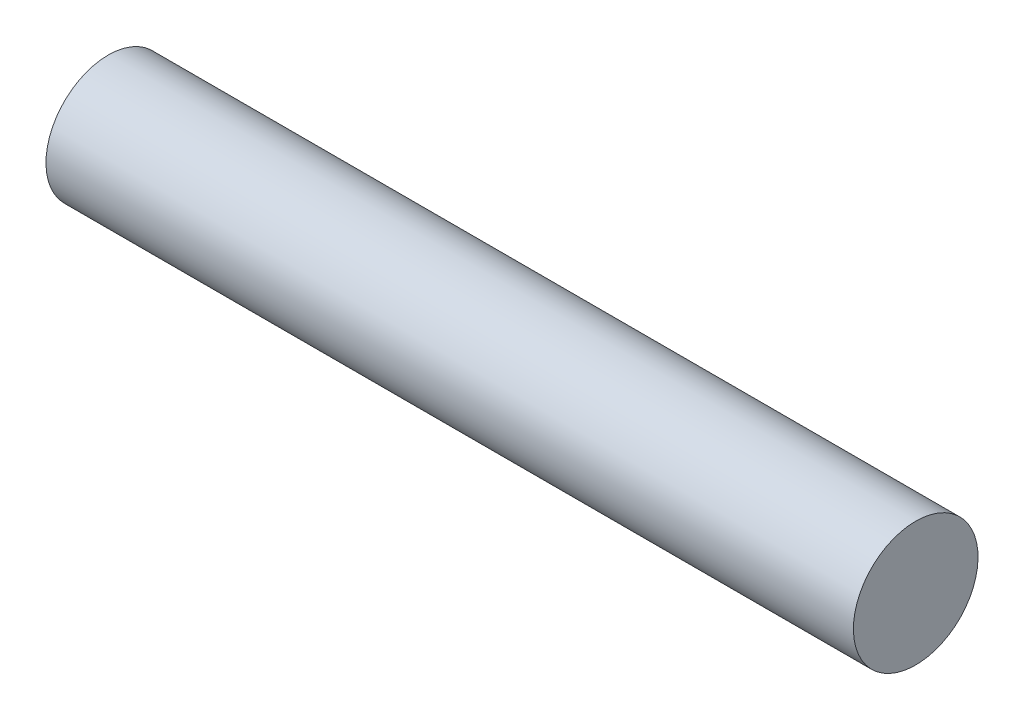
ISO-10303-21;
HEADER;
FILE_DESCRIPTION(('STEP AP214'),'2;1');
FILE_NAME('part.step','',(''),(''),'','','');
FILE_SCHEMA(('AUTOMOTIVE_DESIGN { 1 0 10303 214 1 1 1 1 }'));
ENDSEC;
DATA;
#1=APPLICATION_CONTEXT('core data for automotive mechanical design processes');
#2=APPLICATION_PROTOCOL_DEFINITION('international standard','automotive_design',2000,#1);
#3=PRODUCT_CONTEXT('',#1,'mechanical');
#4=PRODUCT('Part','Part','',(#3));
#5=PRODUCT_RELATED_PRODUCT_CATEGORY('part','',(#4));
#6=PRODUCT_DEFINITION_FORMATION('','',#4);
#7=PRODUCT_DEFINITION_CONTEXT('part definition',#1,'design');
#8=PRODUCT_DEFINITION('design','',#6,#7);
#9=PRODUCT_DEFINITION_SHAPE('','',#8);
#10=(LENGTH_UNIT() NAMED_UNIT(*) SI_UNIT(.MILLI.,.METRE.));
#11=(NAMED_UNIT(*) PLANE_ANGLE_UNIT() SI_UNIT($,.RADIAN.));
#12=(NAMED_UNIT(*) SI_UNIT($,.STERADIAN.) SOLID_ANGLE_UNIT());
#13=UNCERTAINTY_MEASURE_WITH_UNIT(LENGTH_MEASURE(1.E-05),#10,'distance_accuracy_value','');
#14=(GEOMETRIC_REPRESENTATION_CONTEXT(3) GLOBAL_UNCERTAINTY_ASSIGNED_CONTEXT((#13)) GLOBAL_UNIT_ASSIGNED_CONTEXT((#10,
#11,#12)) REPRESENTATION_CONTEXT('',''));
#15=CARTESIAN_POINT('',(0.,0.,0.));
#16=DIRECTION('',(0.,0.,1.));
#17=DIRECTION('',(1.,0.,0.));
#18=AXIS2_PLACEMENT_3D('',#15,#16,#17);
#19=CARTESIAN_POINT('',(46.,3.54999999999999,0.));
#20=DIRECTION('',(1.,0.,0.));
#21=DIRECTION('',(0.,1.,0.));
#22=AXIS2_PLACEMENT_3D('',#19,#20,#21);
#23=PLANE('',#22);
#24=CARTESIAN_POINT('',(46.,0.,0.));
#25=DIRECTION('',(1.,0.,0.));
#26=DIRECTION('',(0.,1.,0.));
#27=AXIS2_PLACEMENT_3D('',#24,#25,#26);
#28=CIRCLE('',#27,3.54999999999999);
#29=CARTESIAN_POINT('',(46.,3.54999999999999,0.));
#30=VERTEX_POINT('',#29);
#31=EDGE_CURVE('E40',#30,#30,#28,.T.);
#32=ORIENTED_EDGE('',*,*,#31,.T.);
#33=EDGE_LOOP('',(#32));
#34=FACE_BOUND('',#33,.T.);
#35=ADVANCED_FACE('F34',(#34),#23,.T.);
#36=CARTESIAN_POINT('',(0.,0.,0.));
#37=DIRECTION('',(-1.,0.,0.));
#38=DIRECTION('',(0.,-1.,0.));
#39=AXIS2_PLACEMENT_3D('',#36,#37,#38);
#40=PLANE('',#39);
#41=CARTESIAN_POINT('',(0.,0.,0.));
#42=DIRECTION('',(1.,0.,0.));
#43=DIRECTION('',(0.,1.,0.));
#44=AXIS2_PLACEMENT_3D('',#41,#42,#43);
#45=CIRCLE('',#44,3.54999999999999);
#46=CARTESIAN_POINT('',(0.,3.54999999999999,0.));
#47=VERTEX_POINT('',#46);
#48=EDGE_CURVE('E10',#47,#47,#45,.T.);
#49=ORIENTED_EDGE('',*,*,#48,.F.);
#50=EDGE_LOOP('',(#49));
#51=FACE_BOUND('',#50,.T.);
#52=ADVANCED_FACE('F49',(#51),#40,.T.);
#53=CARTESIAN_POINT('',(46.,0.,0.));
#54=DIRECTION('',(1.,0.,0.));
#55=DIRECTION('',(0.,1.,0.));
#56=AXIS2_PLACEMENT_3D('',#53,#54,#55);
#57=CYLINDRICAL_SURFACE('',#56,3.54999999999999);
#58=ORIENTED_EDGE('',*,*,#48,.T.);
#59=EDGE_LOOP('',(#58));
#60=FACE_BOUND('',#59,.T.);
#61=ORIENTED_EDGE('',*,*,#31,.F.);
#62=EDGE_LOOP('',(#61));
#63=FACE_BOUND('',#62,.T.);
#64=ADVANCED_FACE('F47',(#60,#63),#57,.T.);
#65=CLOSED_SHELL('',(#35,#52,#64));
#66=MANIFOLD_SOLID_BREP('B2',#65);
#67=ADVANCED_BREP_SHAPE_REPRESENTATION('',(#18,#66),#14);
#68=SHAPE_DEFINITION_REPRESENTATION(#9,#67);
ENDSEC;
END-ISO-10303-21;
